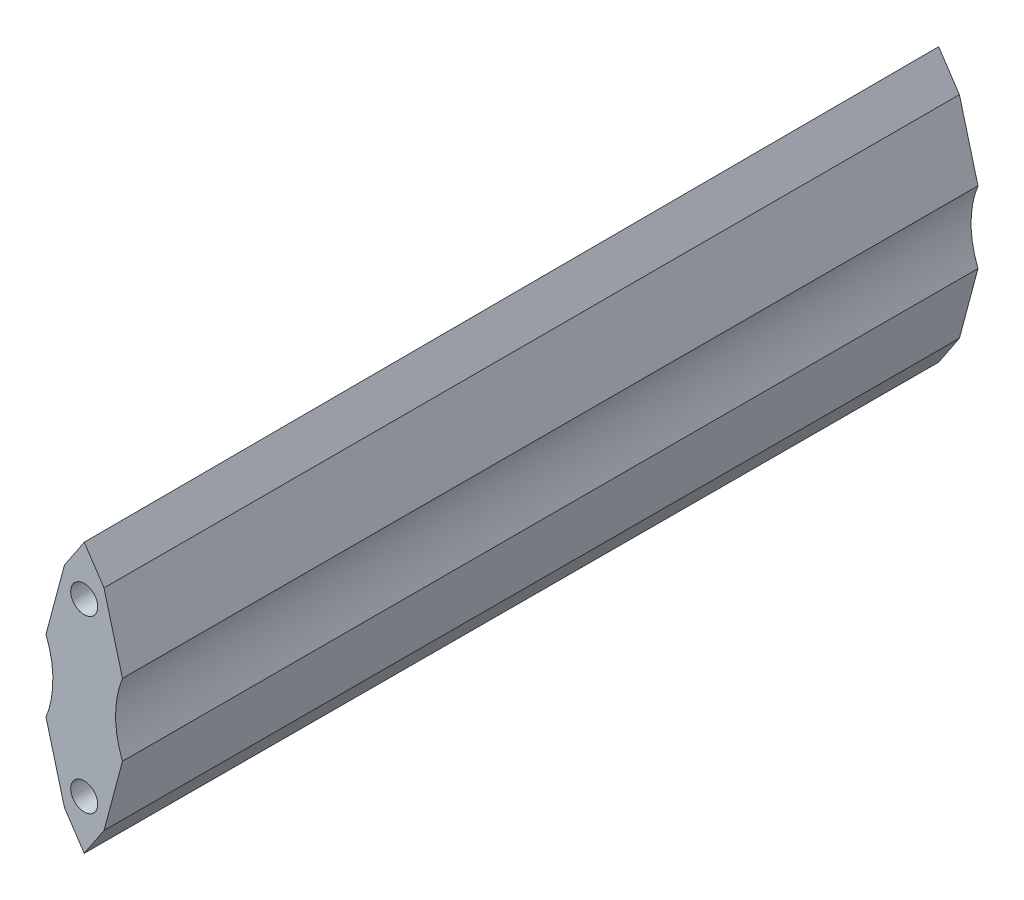
ISO-10303-21;
HEADER;
FILE_DESCRIPTION(('STEP AP214'),'2;1');
FILE_NAME('part.step','',(''),(''),'','','');
FILE_SCHEMA(('AUTOMOTIVE_DESIGN { 1 0 10303 214 1 1 1 1 }'));
ENDSEC;
DATA;
#1=APPLICATION_CONTEXT('core data for automotive mechanical design processes');
#2=APPLICATION_PROTOCOL_DEFINITION('international standard','automotive_design',2000,#1);
#3=PRODUCT_CONTEXT('',#1,'mechanical');
#4=PRODUCT('Part','Part','',(#3));
#5=PRODUCT_RELATED_PRODUCT_CATEGORY('part','',(#4));
#6=PRODUCT_DEFINITION_FORMATION('','',#4);
#7=PRODUCT_DEFINITION_CONTEXT('part definition',#1,'design');
#8=PRODUCT_DEFINITION('design','',#6,#7);
#9=PRODUCT_DEFINITION_SHAPE('','',#8);
#10=(LENGTH_UNIT() NAMED_UNIT(*) SI_UNIT(.MILLI.,.METRE.));
#11=(NAMED_UNIT(*) PLANE_ANGLE_UNIT() SI_UNIT($,.RADIAN.));
#12=(NAMED_UNIT(*) SI_UNIT($,.STERADIAN.) SOLID_ANGLE_UNIT());
#13=UNCERTAINTY_MEASURE_WITH_UNIT(LENGTH_MEASURE(1.E-05),#10,'distance_accuracy_value','');
#14=(GEOMETRIC_REPRESENTATION_CONTEXT(3) GLOBAL_UNCERTAINTY_ASSIGNED_CONTEXT((#13)) GLOBAL_UNIT_ASSIGNED_CONTEXT((#10,
#11,#12)) REPRESENTATION_CONTEXT('',''));
#15=CARTESIAN_POINT('',(0.,0.,0.));
#16=DIRECTION('',(0.,0.,1.));
#17=DIRECTION('',(1.,0.,0.));
#18=AXIS2_PLACEMENT_3D('',#15,#16,#17);
#19=CARTESIAN_POINT('',(0.,0.,709.));
#20=DIRECTION('',(0.,0.,-1.));
#21=DIRECTION('',(-1.,0.,0.));
#22=AXIS2_PLACEMENT_3D('',#19,#20,#21);
#23=PLANE('',#22);
#24=CARTESIAN_POINT('',(0.,0.,709.));
#25=DIRECTION('',(0.,0.,-1.));
#26=DIRECTION('',(-1.,0.,0.));
#27=AXIS2_PLACEMENT_3D('',#24,#25,#26);
#28=CIRCLE('',#27,3.1);
#29=CARTESIAN_POINT('',(-3.1,0.,709.));
#30=VERTEX_POINT('',#29);
#31=EDGE_CURVE('E408',#30,#30,#28,.T.);
#32=ORIENTED_EDGE('',*,*,#31,.T.);
#33=EDGE_LOOP('',(#32));
#34=FACE_BOUND('',#33,.T.);
#35=ADVANCED_FACE('F273',(#34),#23,.T.);
#36=CARTESIAN_POINT('',(0.,0.,709.));
#37=DIRECTION('',(0.,0.,-1.));
#38=DIRECTION('',(-1.,0.,0.));
#39=AXIS2_PLACEMENT_3D('',#36,#37,#38);
#40=CYLINDRICAL_SURFACE('',#39,3.1);
#41=ORIENTED_EDGE('',*,*,#31,.F.);
#42=EDGE_LOOP('',(#41));
#43=FACE_BOUND('',#42,.T.);
#44=CARTESIAN_POINT('',(0.,0.,540.));
#45=DIRECTION('',(0.,0.,-1.));
#46=DIRECTION('',(-1.,0.,0.));
#47=AXIS2_PLACEMENT_3D('',#44,#45,#46);
#48=CIRCLE('',#47,3.1);
#49=CARTESIAN_POINT('',(-3.1,0.,540.));
#50=VERTEX_POINT('',#49);
#51=EDGE_CURVE('E372',#50,#50,#48,.F.);
#52=ORIENTED_EDGE('',*,*,#51,.F.);
#53=EDGE_LOOP('',(#52));
#54=FACE_BOUND('',#53,.T.);
#55=ADVANCED_FACE('F462',(#43,#54),#40,.F.);
#56=CARTESIAN_POINT('',(0.,0.,540.));
#57=DIRECTION('',(0.,0.,-1.));
#58=DIRECTION('',(-1.,0.,0.));
#59=AXIS2_PLACEMENT_3D('',#56,#57,#58);
#60=PLANE('',#59);
#61=DIRECTION('',(-0.554700196225229,0.832050294337843,0.));
#62=VECTOR('',#61,1.);
#63=CARTESIAN_POINT('',(4.43836605132196,22.125577367548,540.));
#64=LINE('',#63,#62);
#65=CARTESIAN_POINT('',(4.3765195891001,22.2183470608808,540.));
#66=VERTEX_POINT('',#65);
#67=CARTESIAN_POINT('',(0.,28.7831264445309,540.));
#68=VERTEX_POINT('',#67);
#69=EDGE_CURVE('E297',#66,#68,#64,.T.);
#70=ORIENTED_EDGE('',*,*,#69,.F.);
#71=DIRECTION('',(-0.257662650560332,0.966234939601246,0.));
#72=VECTOR('',#71,1.);
#73=CARTESIAN_POINT('',(8.34779141576916,7.32607771087177,540.));
#74=LINE('',#73,#72);
#75=CARTESIAN_POINT('',(8.28948820335662,7.5447147574188,540.));
#76=VERTEX_POINT('',#75);
#77=EDGE_CURVE('E365',#76,#66,#74,.T.);
#78=ORIENTED_EDGE('',*,*,#77,.F.);
#79=CARTESIAN_POINT('',(8.28948820335662,-7.5447147574188,540.));
#80=CARTESIAN_POINT('',(8.16788936033876,-7.24327679274731,540.));
#81=CARTESIAN_POINT('',(8.053594474769,-6.93895346568857,540.));
#82=CARTESIAN_POINT('',(7.83983458670277,-6.32513062381595,540.));
#83=CARTESIAN_POINT('',(7.74037009694776,-6.01563093044727,540.));
#84=CARTESIAN_POINT('',(7.46431216810121,-5.07942633163217,540.));
#85=CARTESIAN_POINT('',(7.31039273089406,-4.44585502655953,540.));
#86=CARTESIAN_POINT('',(7.08049748672042,-3.24982862460816,540.));
#87=CARTESIAN_POINT('',(6.99700964322208,-2.68878816076937,540.));
#88=CARTESIAN_POINT('',(6.87754812481308,-1.5614223952776,540.));
#89=CARTESIAN_POINT('',(6.84159104499509,-0.995095317296532,540.));
#90=CARTESIAN_POINT('',(6.81750431666551,0.13875542037362,540.));
#91=CARTESIAN_POINT('',(6.82939197833938,0.706279438879072,540.));
#92=CARTESIAN_POINT('',(6.90095198774333,1.83819521531441,540.));
#93=CARTESIAN_POINT('',(6.9606107941134,2.40258781524157,540.));
#94=CARTESIAN_POINT('',(7.10223869209335,3.35599310594814,540.));
#95=CARTESIAN_POINT('',(7.17215166545461,3.74684201891957,540.));
#96=CARTESIAN_POINT('',(7.33491632560443,4.52372904182977,540.));
#97=CARTESIAN_POINT('',(7.42776640070957,4.90976748777659,540.));
#98=CARTESIAN_POINT('',(7.63590938733737,5.67503186948532,540.));
#99=CARTESIAN_POINT('',(7.75116372749119,6.05426830714647,540.));
#100=CARTESIAN_POINT('',(8.00381988497511,6.8053673766568,540.));
#101=CARTESIAN_POINT('',(8.14122574522677,7.17722864850874,540.));
#102=CARTESIAN_POINT('',(8.28948820335662,7.5447147574188,540.));
#103=B_SPLINE_CURVE_WITH_KNOTS('',3,(#79,#80,#81,#82,#83,#84,#85,#86,#87,#88,#89,#90,#91,#92,
#93,#94,#95,#96,#97,#98,#99,#100,#101,#102),.UNSPECIFIED.,.F.,.F.,(4,2,2,2,2,2,2,2,2,2,2,4),(0.,
0.974912469298583,1.94985863710311,3.90245406134598,5.60220869075517,7.30255662310152,
9.00351979512776,10.7040009773577,11.8945210233999,13.0849574409191,14.2733622596533,
15.4619842227735),.UNSPECIFIED.);
#104=CARTESIAN_POINT('',(8.28948820335662,-7.5447147574188,540.));
#105=VERTEX_POINT('',#104);
#106=EDGE_CURVE('E466',#105,#76,#103,.T.);
#107=ORIENTED_EDGE('',*,*,#106,.F.);
#108=DIRECTION('',(0.257662650560332,0.966234939601246,0.));
#109=VECTOR('',#108,1.);
#110=CARTESIAN_POINT('',(4.34779141576916,-22.3260777108718,540.));
#111=LINE('',#110,#109);
#112=CARTESIAN_POINT('',(4.3765195891001,-22.2183470608808,540.));
#113=VERTEX_POINT('',#112);
#114=EDGE_CURVE('E427',#113,#105,#111,.T.);
#115=ORIENTED_EDGE('',*,*,#114,.F.);
#116=DIRECTION('',(0.554700196225229,0.832050294337843,0.));
#117=VECTOR('',#116,1.);
#118=CARTESIAN_POINT('',(-0.561633948678042,-29.625577367548,540.));
#119=LINE('',#118,#117);
#120=CARTESIAN_POINT('',(0.,-28.7831264445309,540.));
#121=VERTEX_POINT('',#120);
#122=EDGE_CURVE('E425',#121,#113,#119,.T.);
#123=ORIENTED_EDGE('',*,*,#122,.F.);
#124=DIRECTION('',(0.554700196225229,-0.832050294337843,0.));
#125=VECTOR('',#124,1.);
#126=CARTESIAN_POINT('',(-4.43836605132195,-22.125577367548,540.));
#127=LINE('',#126,#125);
#128=CARTESIAN_POINT('',(-4.37651958910009,-22.2183470608808,540.));
#129=VERTEX_POINT('',#128);
#130=EDGE_CURVE('E511',#129,#121,#127,.T.);
#131=ORIENTED_EDGE('',*,*,#130,.F.);
#132=DIRECTION('',(0.257662650560333,-0.966234939601246,0.));
#133=VECTOR('',#132,1.);
#134=CARTESIAN_POINT('',(-8.34779141576916,-7.32607771087178,540.));
#135=LINE('',#134,#133);
#136=CARTESIAN_POINT('',(-8.28948820335662,-7.54471475741881,540.));
#137=VERTEX_POINT('',#136);
#138=EDGE_CURVE('E480',#137,#129,#135,.T.);
#139=ORIENTED_EDGE('',*,*,#138,.F.);
#140=CARTESIAN_POINT('',(-8.28948820335662,7.54471475741881,540.));
#141=CARTESIAN_POINT('',(-8.16788936033876,7.24327679274732,540.));
#142=CARTESIAN_POINT('',(-8.053594474769,6.93895346568857,540.));
#143=CARTESIAN_POINT('',(-7.83983458670277,6.32513062381596,540.));
#144=CARTESIAN_POINT('',(-7.74037009694775,6.01563093044728,540.));
#145=CARTESIAN_POINT('',(-7.46431216810121,5.07942633163218,540.));
#146=CARTESIAN_POINT('',(-7.31039273089407,4.44585502655955,540.));
#147=CARTESIAN_POINT('',(-7.08049748672043,3.24982862460817,540.));
#148=CARTESIAN_POINT('',(-6.99700964322208,2.68878816076938,540.));
#149=CARTESIAN_POINT('',(-6.87754812481308,1.56142239527761,540.));
#150=CARTESIAN_POINT('',(-6.84159104499509,0.995095317296534,540.));
#151=CARTESIAN_POINT('',(-6.81750431666551,-0.138755420373625,540.));
#152=CARTESIAN_POINT('',(-6.82939197833938,-0.706279438879081,540.));
#153=CARTESIAN_POINT('',(-6.90095198774333,-1.83819521531443,540.));
#154=CARTESIAN_POINT('',(-6.9606107941134,-2.40258781524159,540.));
#155=CARTESIAN_POINT('',(-7.10223869209336,-3.35599310594816,540.));
#156=CARTESIAN_POINT('',(-7.17215166545461,-3.74684201891959,540.));
#157=CARTESIAN_POINT('',(-7.33491632560443,-4.52372904182979,540.));
#158=CARTESIAN_POINT('',(-7.42776640070957,-4.9097674877766,540.));
#159=CARTESIAN_POINT('',(-7.63590938733738,-5.67503186948533,540.));
#160=CARTESIAN_POINT('',(-7.75116372749119,-6.05426830714648,540.));
#161=CARTESIAN_POINT('',(-8.00381988497512,-6.80536737665681,540.));
#162=CARTESIAN_POINT('',(-8.14122574522677,-7.17722864850875,540.));
#163=CARTESIAN_POINT('',(-8.28948820335662,-7.54471475741881,540.));
#164=B_SPLINE_CURVE_WITH_KNOTS('',3,(#140,#141,#142,#143,#144,#145,#146,#147,#148,#149,#150,
#151,#152,#153,#154,#155,#156,#157,#158,#159,#160,#161,#162,#163),.UNSPECIFIED.,.F.,.F.,(4,2,2,
2,2,2,2,2,2,2,2,4),(0.,0.974912469298578,1.9498586371031,3.90245406134596,5.60220869075516,
7.30255662310153,9.00351979512778,10.7040009773578,11.8945210233999,13.0849574409191,
14.2733622596533,15.4619842227735),.UNSPECIFIED.);
#165=CARTESIAN_POINT('',(-8.28948820335662,7.54471475741881,540.));
#166=VERTEX_POINT('',#165);
#167=EDGE_CURVE('E473',#166,#137,#164,.T.);
#168=ORIENTED_EDGE('',*,*,#167,.F.);
#169=DIRECTION('',(-0.257662650560333,-0.966234939601246,0.));
#170=VECTOR('',#169,1.);
#171=CARTESIAN_POINT('',(-4.34779141576916,22.3260777108718,540.));
#172=LINE('',#171,#170);
#173=CARTESIAN_POINT('',(-4.37651958910009,22.2183470608808,540.));
#174=VERTEX_POINT('',#173);
#175=EDGE_CURVE('E483',#174,#166,#172,.T.);
#176=ORIENTED_EDGE('',*,*,#175,.F.);
#177=DIRECTION('',(-0.554700196225229,-0.832050294337843,0.));
#178=VECTOR('',#177,1.);
#179=CARTESIAN_POINT('',(0.561633948678049,29.625577367548,540.));
#180=LINE('',#179,#178);
#181=EDGE_CURVE('E485',#68,#174,#180,.T.);
#182=ORIENTED_EDGE('',*,*,#181,.F.);
#183=EDGE_LOOP('',(#70,#78,#107,#115,#123,#131,#139,#168,#176,#182));
#184=FACE_BOUND('',#183,.T.);
#185=ORIENTED_EDGE('',*,*,#51,.T.);
#186=EDGE_LOOP('',(#185));
#187=FACE_BOUND('',#186,.T.);
#188=CARTESIAN_POINT('',(0.,-18.,540.));
#189=DIRECTION('',(0.,0.,-1.));
#190=DIRECTION('',(-1.,0.,0.));
#191=AXIS2_PLACEMENT_3D('',#188,#189,#190);
#192=CIRCLE('',#191,2.85);
#193=CARTESIAN_POINT('',(-2.85,-18.,540.));
#194=VERTEX_POINT('',#193);
#195=EDGE_CURVE('E517',#194,#194,#192,.F.);
#196=ORIENTED_EDGE('',*,*,#195,.T.);
#197=EDGE_LOOP('',(#196));
#198=FACE_BOUND('',#197,.T.);
#199=CARTESIAN_POINT('',(0.,18.,540.));
#200=DIRECTION('',(0.,0.,-1.));
#201=DIRECTION('',(-1.,0.,0.));
#202=AXIS2_PLACEMENT_3D('',#199,#200,#201);
#203=CIRCLE('',#202,2.85);
#204=CARTESIAN_POINT('',(-2.85,18.,540.));
#205=VERTEX_POINT('',#204);
#206=EDGE_CURVE('E515',#205,#205,#203,.F.);
#207=ORIENTED_EDGE('',*,*,#206,.T.);
#208=EDGE_LOOP('',(#207));
#209=FACE_BOUND('',#208,.T.);
#210=ADVANCED_FACE('F456',(#184,#187,#198,#209),#60,.T.);
#211=CARTESIAN_POINT('',(0.,-18.,795.));
#212=DIRECTION('',(0.,0.,-1.));
#213=DIRECTION('',(-1.,0.,0.));
#214=AXIS2_PLACEMENT_3D('',#211,#212,#213);
#215=CYLINDRICAL_SURFACE('',#214,2.85);
#216=CARTESIAN_POINT('',(0.,-18.,720.));
#217=DIRECTION('',(0.,0.,-1.));
#218=DIRECTION('',(-1.,0.,0.));
#219=AXIS2_PLACEMENT_3D('',#216,#217,#218);
#220=CIRCLE('',#219,2.85);
#221=CARTESIAN_POINT('',(-2.85,-18.,720.));
#222=VERTEX_POINT('',#221);
#223=EDGE_CURVE('E522',#222,#222,#220,.F.);
#224=ORIENTED_EDGE('',*,*,#223,.T.);
#225=EDGE_LOOP('',(#224));
#226=FACE_BOUND('',#225,.T.);
#227=ORIENTED_EDGE('',*,*,#195,.F.);
#228=EDGE_LOOP('',(#227));
#229=FACE_BOUND('',#228,.T.);
#230=ADVANCED_FACE('F461',(#226,#229),#215,.F.);
#231=CARTESIAN_POINT('',(0.,18.,795.));
#232=DIRECTION('',(0.,0.,-1.));
#233=DIRECTION('',(-1.,0.,0.));
#234=AXIS2_PLACEMENT_3D('',#231,#232,#233);
#235=CYLINDRICAL_SURFACE('',#234,2.85);
#236=CARTESIAN_POINT('',(0.,18.,720.));
#237=DIRECTION('',(0.,0.,-1.));
#238=DIRECTION('',(-1.,0.,0.));
#239=AXIS2_PLACEMENT_3D('',#236,#237,#238);
#240=CIRCLE('',#239,2.85);
#241=CARTESIAN_POINT('',(-2.85,18.,720.));
#242=VERTEX_POINT('',#241);
#243=EDGE_CURVE('E525',#242,#242,#240,.F.);
#244=ORIENTED_EDGE('',*,*,#243,.T.);
#245=EDGE_LOOP('',(#244));
#246=FACE_BOUND('',#245,.T.);
#247=ORIENTED_EDGE('',*,*,#206,.F.);
#248=EDGE_LOOP('',(#247));
#249=FACE_BOUND('',#248,.T.);
#250=ADVANCED_FACE('F530',(#246,#249),#235,.F.);
#251=CARTESIAN_POINT('',(0.,30.,0.));
#252=DIRECTION('',(-0.832049644299313,0.554699762866209,0.00124999902343864));
#253=DIRECTION('',(-0.554700196225229,-0.832050294337843,0.));
#254=AXIS2_PLACEMENT_3D('',#251,#252,#253);
#255=PLANE('',#254);
#256=DIRECTION('',(-0.554700196225229,-0.832050294337843,0.));
#257=VECTOR('',#256,1.);
#258=CARTESIAN_POINT('',(0.748845264904063,29.5007698233973,720.));
#259=LINE('',#258,#257);
#260=CARTESIAN_POINT('',(0.,28.3775019260412,720.));
#261=VERTEX_POINT('',#260);
#262=CARTESIAN_POINT('',(-4.16869278546679,22.124462747841,720.));
#263=VERTEX_POINT('',#262);
#264=EDGE_CURVE('E493',#261,#263,#259,.T.);
#265=ORIENTED_EDGE('',*,*,#264,.F.);
#266=DIRECTION('',(0.,0.00225346382548676,-0.99999746094717));
#267=VECTOR('',#266,1.);
#268=CARTESIAN_POINT('',(0.,29.098612181134,400.));
#269=LINE('',#268,#267);
#270=EDGE_CURVE('E277',#261,#68,#269,.T.);
#271=ORIENTED_EDGE('',*,*,#270,.T.);
#272=ORIENTED_EDGE('',*,*,#181,.T.);
#273=DIRECTION('',(0.00115459242688266,-0.000521579098286261,0.999999197435464));
#274=VECTOR('',#273,1.);
#275=CARTESIAN_POINT('',(-4.53816265859266,22.291368193245,400.));
#276=LINE('',#275,#274);
#277=EDGE_CURVE('E386',#174,#263,#276,.T.);
#278=ORIENTED_EDGE('',*,*,#277,.T.);
#279=EDGE_LOOP('',(#265,#271,#272,#278));
#280=FACE_BOUND('',#279,.T.);
#281=ADVANCED_FACE('F492',(#280),#255,.T.);
#282=CARTESIAN_POINT('',(-5.,22.5,0.));
#283=DIRECTION('',(-0.966234184731084,0.257662449261623,0.00124999902343865));
#284=DIRECTION('',(-0.257662650560333,-0.966234939601246,0.));
#285=AXIS2_PLACEMENT_3D('',#282,#283,#284);
#286=PLANE('',#285);
#287=DIRECTION('',(-0.257662650560333,-0.966234939601246,0.));
#288=VECTOR('',#287,1.);
#289=CARTESIAN_POINT('',(-4.13038855435887,22.2681036144957,720.));
#290=LINE('',#289,#288);
#291=CARTESIAN_POINT('',(-8.05265093780882,7.55961967655841,720.));
#292=VERTEX_POINT('',#291);
#293=EDGE_CURVE('E362',#263,#292,#290,.T.);
#294=ORIENTED_EDGE('',*,*,#293,.F.);
#295=ORIENTED_EDGE('',*,*,#277,.F.);
#296=ORIENTED_EDGE('',*,*,#175,.T.);
#297=DIRECTION('',(0.00131576144292263,8.2805034369932E-05,0.999999130957198));
#298=VECTOR('',#297,1.);
#299=CARTESIAN_POINT('',(-8.47369496544935,7.53312204253245,400.));
#300=LINE('',#299,#298);
#301=EDGE_CURVE('E389',#166,#292,#300,.T.);
#302=ORIENTED_EDGE('',*,*,#301,.T.);
#303=EDGE_LOOP('',(#294,#295,#296,#302));
#304=FACE_BOUND('',#303,.T.);
#305=ADVANCED_FACE('F498',(#304),#286,.T.);
#306=CARTESIAN_POINT('',(5.,22.5,0.));
#307=DIRECTION('',(0.832049644299313,0.554699762866209,0.00124999902343864));
#308=DIRECTION('',(-0.554700196225229,0.832050294337843,0.));
#309=AXIS2_PLACEMENT_3D('',#306,#307,#308);
#310=PLANE('',#309);
#311=DIRECTION('',(-0.554700196225229,0.832050294337843,0.));
#312=VECTOR('',#311,1.);
#313=CARTESIAN_POINT('',(4.25115473509594,22.0007698233973,720.));
#314=LINE('',#313,#312);
#315=CARTESIAN_POINT('',(4.1686927854668,22.124462747841,720.));
#316=VERTEX_POINT('',#315);
#317=EDGE_CURVE('E352',#316,#261,#314,.T.);
#318=ORIENTED_EDGE('',*,*,#317,.F.);
#319=DIRECTION('',(-0.00115459242688266,-0.000521579098286261,0.999999197435464));
#320=VECTOR('',#319,1.);
#321=CARTESIAN_POINT('',(4.53816265859267,22.291368193245,400.));
#322=LINE('',#321,#320);
#323=EDGE_CURVE('E283',#66,#316,#322,.T.);
#324=ORIENTED_EDGE('',*,*,#323,.F.);
#325=ORIENTED_EDGE('',*,*,#69,.T.);
#326=ORIENTED_EDGE('',*,*,#270,.F.);
#327=EDGE_LOOP('',(#318,#324,#325,#326));
#328=FACE_BOUND('',#327,.T.);
#329=ADVANCED_FACE('F361',(#328),#310,.T.);
#330=CARTESIAN_POINT('',(-9.,7.5,0.));
#331=CARTESIAN_POINT('',(-7.94738993089869,7.5662440850649,800.));
#332=CARTESIAN_POINT('',(-8.75325555323637,6.9078133277673,0.));
#333=CARTESIAN_POINT('',(-7.70903785971492,6.96604813310095,800.));
#334=CARTESIAN_POINT('',(-8.31825720304425,5.69906975911781,0.));
#335=CARTESIAN_POINT('',(-7.28909415940078,5.74311601064957,800.000000000001));
#336=CARTESIAN_POINT('',(-7.84760675080053,3.8304786498399,0.));
#337=CARTESIAN_POINT('',(-6.83510364276034,3.85745789019627,799.999999999999));
#338=CARTESIAN_POINT('',(-7.5633644339186,1.92460591348961,0.));
#339=CARTESIAN_POINT('',(-6.56107216414013,1.93737438025298,800.));
#340=CARTESIAN_POINT('',(-7.5,0.641535561585432,0.));
#341=CARTESIAN_POINT('',(-6.5,0.645791677394109,800.));
#342=CARTESIAN_POINT('',(-7.5,-0.641535561585428,0.));
#343=CARTESIAN_POINT('',(-6.5,-0.64579167739411,800.));
#344=CARTESIAN_POINT('',(-7.56336443391862,-1.92460591348961,0.));
#345=CARTESIAN_POINT('',(-6.56107216414012,-1.93737438025299,799.999999999999));
#346=CARTESIAN_POINT('',(-7.84760675080051,-3.83047864983989,0.));
#347=CARTESIAN_POINT('',(-6.83510364276035,-3.85745789019627,800.000000000001));
#348=CARTESIAN_POINT('',(-8.31825720304427,-5.69906975911781,0.));
#349=CARTESIAN_POINT('',(-7.28909415940077,-5.74311601064957,800.));
#350=CARTESIAN_POINT('',(-8.75325555323637,-6.90781332776729,0.));
#351=CARTESIAN_POINT('',(-7.70903785971492,-6.96604813310096,800.));
#352=CARTESIAN_POINT('',(-9.,-7.5,0.));
#353=CARTESIAN_POINT('',(-7.94738993089869,-7.5662440850649,800.));
#354=B_SPLINE_SURFACE_WITH_KNOTS('',3,1,((#330,#331),(#332,#333),(#334,#335),(#336,#337),(#338,
#339),(#340,#341),(#342,#343),(#344,#345),(#346,#347),(#348,#349),(#350,#351),(#352,#353)),
.UNSPECIFIED.,.F.,.F.,.F.,(4,1,1,1,2,1,1,1,4),(2,2),(0.,0.125,0.25,0.375,0.5,0.625,0.75,0.875,
1.),(0.,1.),.UNSPECIFIED.);
#355=CARTESIAN_POINT('',(-8.05265093780882,7.55961967655841,720.));
#356=CARTESIAN_POINT('',(-7.93220568628093,7.25777733363349,720.));
#357=CARTESIAN_POINT('',(-7.81899002130977,6.95310929630239,720.));
#358=CARTESIAN_POINT('',(-7.60723320406377,6.33870504577705,720.));
#359=CARTESIAN_POINT('',(-7.50869250710435,6.0289686756601,720.));
#360=CARTESIAN_POINT('',(-7.23515391465796,5.0921612173794,720.));
#361=CARTESIAN_POINT('',(-7.08258797794095,4.45836512307391,720.));
#362=CARTESIAN_POINT('',(-6.85334817282111,3.25570753730072,720.));
#363=CARTESIAN_POINT('',(-6.76978546233478,2.6881336602734,720.));
#364=CARTESIAN_POINT('',(-6.65072532514923,1.54771331074024,720.));
#365=CARTESIAN_POINT('',(-6.61524502688033,0.974865032454896,720.));
#366=CARTESIAN_POINT('',(-6.59266060956356,-0.171953808416335,720.));
#367=CARTESIAN_POINT('',(-6.60557290139224,-0.745924685734591,720.));
#368=CARTESIAN_POINT('',(-6.67972163339617,-1.89061917109885,720.));
#369=CARTESIAN_POINT('',(-6.7409438119009,-2.46134368743574,720.));
#370=CARTESIAN_POINT('',(-6.88433959413653,-3.41647443128717,720.));
#371=CARTESIAN_POINT('',(-6.95380380244713,-3.80283899241907,720.));
#372=CARTESIAN_POINT('',(-7.11490067329191,-4.57091314431726,720.));
#373=CARTESIAN_POINT('',(-7.20653171780184,-4.9526230727041,720.));
#374=CARTESIAN_POINT('',(-7.4114805698083,-5.70943893134181,720.));
#375=CARTESIAN_POINT('',(-7.52475942830775,-6.08455542069633,720.));
#376=CARTESIAN_POINT('',(-7.77273795736463,-6.82771802305068,720.));
#377=CARTESIAN_POINT('',(-7.90744164253734,-7.1957627964267,720.));
#378=CARTESIAN_POINT('',(-8.05265093780882,-7.55961967655841,720.));
#379=B_SPLINE_CURVE_WITH_KNOTS('',3,(#355,#356,#357,#358,#359,#360,#361,#362,#363,#364,#365,
#366,#367,#368,#369,#370,#371,#372,#373,#374,#375,#376,#377,#378),.UNSPECIFIED.,.F.,.F.,(4,2,2,
2,2,2,2,2,2,2,2,4),(0.,0.974755186623848,1.9495406103593,3.90192081303197,5.62106982350202,
7.34083108675059,9.06117560754088,10.781012451464,11.9580921364717,13.135085928792,
14.3099816654009,15.4850978156175),.UNSPECIFIED.);
#380=CARTESIAN_POINT('',(-8.05265093780882,-7.55961967655841,720.));
#381=VERTEX_POINT('',#380);
#382=EDGE_CURVE('E363',#292,#381,#379,.T.);
#383=DIRECTION('',(0.00131576144292262,-8.28050343699494E-05,0.999999130957198));
#384=VECTOR('',#383,1.);
#385=CARTESIAN_POINT('',(-8.47369496544935,-7.53312204253245,400.));
#386=LINE('',#385,#384);
#387=EDGE_CURVE('E392',#137,#381,#386,.T.);
#388=ORIENTED_EDGE('',*,*,#382,.F.);
#389=ORIENTED_EDGE('',*,*,#301,.F.);
#390=ORIENTED_EDGE('',*,*,#167,.T.);
#391=ORIENTED_EDGE('',*,*,#387,.T.);
#392=EDGE_LOOP('',(#388,#389,#390,#391));
#393=FACE_BOUND('',#392,.T.);
#394=ADVANCED_FACE('F446',(#393),#354,.T.);
#395=CARTESIAN_POINT('',(-9.,-7.5,0.));
#396=DIRECTION('',(-0.966234184731084,-0.257662449261623,0.00124999902343865));
#397=DIRECTION('',(0.257662650560333,-0.966234939601246,0.));
#398=AXIS2_PLACEMENT_3D('',#395,#396,#397);
#399=PLANE('',#398);
#400=DIRECTION('',(0.257662650560333,-0.966234939601246,0.));
#401=VECTOR('',#400,1.);
#402=CARTESIAN_POINT('',(-8.13038855435888,-7.2681036144957,720.));
#403=LINE('',#402,#401);
#404=CARTESIAN_POINT('',(-4.16869278546679,-22.124462747841,720.));
#405=VERTEX_POINT('',#404);
#406=EDGE_CURVE('E439',#381,#405,#403,.T.);
#407=ORIENTED_EDGE('',*,*,#406,.F.);
#408=ORIENTED_EDGE('',*,*,#387,.F.);
#409=ORIENTED_EDGE('',*,*,#138,.T.);
#410=DIRECTION('',(0.00115459242688266,0.000521579098286261,0.999999197435464));
#411=VECTOR('',#410,1.);
#412=CARTESIAN_POINT('',(-4.53816265859266,-22.291368193245,400.));
#413=LINE('',#412,#411);
#414=EDGE_CURVE('E395',#129,#405,#413,.T.);
#415=ORIENTED_EDGE('',*,*,#414,.T.);
#416=EDGE_LOOP('',(#407,#408,#409,#415));
#417=FACE_BOUND('',#416,.T.);
#418=ADVANCED_FACE('F505',(#417),#399,.T.);
#419=CARTESIAN_POINT('',(-5.,-22.5,0.));
#420=DIRECTION('',(-0.832049644299313,-0.554699762866209,0.00124999902343864));
#421=DIRECTION('',(0.554700196225229,-0.832050294337843,0.));
#422=AXIS2_PLACEMENT_3D('',#419,#420,#421);
#423=PLANE('',#422);
#424=DIRECTION('',(0.554700196225229,-0.832050294337843,0.));
#425=VECTOR('',#424,1.);
#426=CARTESIAN_POINT('',(-4.25115473509594,-22.0007698233973,720.));
#427=LINE('',#426,#425);
#428=CARTESIAN_POINT('',(0.,-28.3775019260412,720.));
#429=VERTEX_POINT('',#428);
#430=EDGE_CURVE('E430',#405,#429,#427,.T.);
#431=ORIENTED_EDGE('',*,*,#430,.F.);
#432=ORIENTED_EDGE('',*,*,#414,.F.);
#433=ORIENTED_EDGE('',*,*,#130,.T.);
#434=DIRECTION('',(0.,0.00225346382548676,0.99999746094717));
#435=VECTOR('',#434,1.);
#436=CARTESIAN_POINT('',(0.,-29.098612181134,400.));
#437=LINE('',#436,#435);
#438=EDGE_CURVE('E400',#121,#429,#437,.T.);
#439=ORIENTED_EDGE('',*,*,#438,.T.);
#440=EDGE_LOOP('',(#431,#432,#433,#439));
#441=FACE_BOUND('',#440,.T.);
#442=ADVANCED_FACE('F510',(#441),#423,.T.);
#443=CARTESIAN_POINT('',(0.,-30.,0.));
#444=DIRECTION('',(0.832049644299313,-0.554699762866209,0.00124999902343864));
#445=DIRECTION('',(0.554700196225229,0.832050294337843,0.));
#446=AXIS2_PLACEMENT_3D('',#443,#444,#445);
#447=PLANE('',#446);
#448=DIRECTION('',(0.554700196225229,0.832050294337843,0.));
#449=VECTOR('',#448,1.);
#450=CARTESIAN_POINT('',(-0.748845264904056,-29.5007698233973,720.));
#451=LINE('',#450,#449);
#452=CARTESIAN_POINT('',(4.1686927854668,-22.124462747841,720.));
#453=VERTEX_POINT('',#452);
#454=EDGE_CURVE('E424',#429,#453,#451,.T.);
#455=ORIENTED_EDGE('',*,*,#454,.F.);
#456=ORIENTED_EDGE('',*,*,#438,.F.);
#457=ORIENTED_EDGE('',*,*,#122,.T.);
#458=DIRECTION('',(-0.00115459242688266,0.000521579098286261,0.999999197435464));
#459=VECTOR('',#458,1.);
#460=CARTESIAN_POINT('',(4.53816265859267,-22.291368193245,400.));
#461=LINE('',#460,#459);
#462=EDGE_CURVE('E404',#113,#453,#461,.T.);
#463=ORIENTED_EDGE('',*,*,#462,.T.);
#464=EDGE_LOOP('',(#455,#456,#457,#463));
#465=FACE_BOUND('',#464,.T.);
#466=ADVANCED_FACE('F422',(#465),#447,.T.);
#467=CARTESIAN_POINT('',(5.,-22.5,0.));
#468=DIRECTION('',(0.966234184731084,-0.257662449261622,0.00124999902343865));
#469=DIRECTION('',(0.257662650560332,0.966234939601246,0.));
#470=AXIS2_PLACEMENT_3D('',#467,#468,#469);
#471=PLANE('',#470);
#472=DIRECTION('',(0.257662650560332,0.966234939601246,0.));
#473=VECTOR('',#472,1.);
#474=CARTESIAN_POINT('',(4.13038855435888,-22.2681036144957,720.));
#475=LINE('',#474,#473);
#476=CARTESIAN_POINT('',(8.05265093780882,-7.55961967655841,720.));
#477=VERTEX_POINT('',#476);
#478=EDGE_CURVE('E428',#453,#477,#475,.T.);
#479=ORIENTED_EDGE('',*,*,#478,.F.);
#480=ORIENTED_EDGE('',*,*,#462,.F.);
#481=ORIENTED_EDGE('',*,*,#114,.T.);
#482=DIRECTION('',(-0.00131576144292263,-8.28050343699494E-05,0.999999130957198));
#483=VECTOR('',#482,1.);
#484=CARTESIAN_POINT('',(8.47369496544935,-7.53312204253245,400.));
#485=LINE('',#484,#483);
#486=EDGE_CURVE('E368',#105,#477,#485,.T.);
#487=ORIENTED_EDGE('',*,*,#486,.T.);
#488=EDGE_LOOP('',(#479,#480,#481,#487));
#489=FACE_BOUND('',#488,.T.);
#490=ADVANCED_FACE('F426',(#489),#471,.T.);
#491=CARTESIAN_POINT('',(9.,-7.5,0.));
#492=CARTESIAN_POINT('',(7.94738993089869,-7.5662440850649,800.));
#493=CARTESIAN_POINT('',(8.75325555323637,-6.90781332776729,0.));
#494=CARTESIAN_POINT('',(7.70903785971492,-6.96604813310095,800.));
#495=CARTESIAN_POINT('',(8.31825720304428,-5.69906975911781,0.));
#496=CARTESIAN_POINT('',(7.28909415940079,-5.74311601064957,800.000000000001));
#497=CARTESIAN_POINT('',(7.8476067508005,-3.83047864983989,0.));
#498=CARTESIAN_POINT('',(6.83510364276033,-3.85745789019627,799.999999999999));
#499=CARTESIAN_POINT('',(7.56336443391863,-1.92460591348961,0.));
#500=CARTESIAN_POINT('',(6.56107216414014,-1.93737438025299,800.000000000001));
#501=CARTESIAN_POINT('',(7.5,-0.64153556158543,0.));
#502=CARTESIAN_POINT('',(6.5,-0.645791677394112,800.));
#503=CARTESIAN_POINT('',(7.5,0.64153556158543,0.));
#504=CARTESIAN_POINT('',(6.5,0.645791677394106,800.));
#505=CARTESIAN_POINT('',(7.56336443391863,1.92460591348961,0.));
#506=CARTESIAN_POINT('',(6.56107216414012,1.93737438025298,800.));
#507=CARTESIAN_POINT('',(7.8476067508005,3.83047864983989,0.));
#508=CARTESIAN_POINT('',(6.83510364276035,3.85745789019627,800.));
#509=CARTESIAN_POINT('',(8.31825720304427,5.69906975911781,0.));
#510=CARTESIAN_POINT('',(7.28909415940077,5.74311601064956,800.));
#511=CARTESIAN_POINT('',(8.75325555323637,6.9078133277673,0.));
#512=CARTESIAN_POINT('',(7.70903785971492,6.96604813310095,800.));
#513=CARTESIAN_POINT('',(9.,7.5,0.));
#514=CARTESIAN_POINT('',(7.94738993089869,7.56624408506489,800.));
#515=B_SPLINE_SURFACE_WITH_KNOTS('',3,1,((#491,#492),(#493,#494),(#495,#496),(#497,#498),(#499,
#500),(#501,#502),(#503,#504),(#505,#506),(#507,#508),(#509,#510),(#511,#512),(#513,#514)),
.UNSPECIFIED.,.F.,.F.,.F.,(4,1,1,1,2,1,1,1,4),(2,2),(0.,0.125,0.25,0.375,0.5,0.625,0.75,0.875,
1.),(0.,1.),.UNSPECIFIED.);
#516=CARTESIAN_POINT('',(8.05265093780882,-7.55961967655841,720.));
#517=CARTESIAN_POINT('',(7.93220568628093,-7.25777733363349,720.));
#518=CARTESIAN_POINT('',(7.81899002130977,-6.95310929630238,720.));
#519=CARTESIAN_POINT('',(7.60723320406377,-6.33870504577704,720.));
#520=CARTESIAN_POINT('',(7.50869250710435,-6.02896867566009,720.));
#521=CARTESIAN_POINT('',(7.23515391465796,-5.09216121737938,720.));
#522=CARTESIAN_POINT('',(7.08258797794094,-4.45836512307389,720.));
#523=CARTESIAN_POINT('',(6.85334817282111,-3.25570753730072,720.));
#524=CARTESIAN_POINT('',(6.76978546233478,-2.68813366027342,720.));
#525=CARTESIAN_POINT('',(6.65072532514923,-1.5477133107403,720.));
#526=CARTESIAN_POINT('',(6.61524502688034,-0.974865032454978,720.));
#527=CARTESIAN_POINT('',(6.59266060956356,0.171953808416211,720.));
#528=CARTESIAN_POINT('',(6.60557290139224,0.745924685734447,720.));
#529=CARTESIAN_POINT('',(6.67972163339615,1.89061917109867,720.));
#530=CARTESIAN_POINT('',(6.74094381190088,2.46134368743553,720.));
#531=CARTESIAN_POINT('',(6.8843395941365,3.41647443128696,720.));
#532=CARTESIAN_POINT('',(6.95380380244709,3.80283899241888,720.));
#533=CARTESIAN_POINT('',(7.11490067329188,4.57091314431711,720.));
#534=CARTESIAN_POINT('',(7.2065317178018,4.95262307270397,720.));
#535=CARTESIAN_POINT('',(7.41148056980827,5.70943893134171,720.));
#536=CARTESIAN_POINT('',(7.52475942830772,6.08455542069625,720.));
#537=CARTESIAN_POINT('',(7.77273795736462,6.82771802305064,720.));
#538=CARTESIAN_POINT('',(7.90744164253733,7.19576279642667,720.));
#539=CARTESIAN_POINT('',(8.05265093780882,7.5596196765584,720.));
#540=B_SPLINE_CURVE_WITH_KNOTS('',3,(#516,#517,#518,#519,#520,#521,#522,#523,#524,#525,#526,
#527,#528,#529,#530,#531,#532,#533,#534,#535,#536,#537,#538,#539),.UNSPECIFIED.,.F.,.F.,(4,2,2,
2,2,2,2,2,2,2,2,4),(0.,0.974755186623853,1.94954061035931,3.90192081303199,5.62106982350198,
7.34083108675049,9.06117560754071,10.7810124514638,11.9580921364715,13.1350859287919,
14.3099816654008,15.4850978156175),.UNSPECIFIED.);
#541=CARTESIAN_POINT('',(8.05265093780882,7.5596196765584,720.));
#542=VERTEX_POINT('',#541);
#543=EDGE_CURVE('E289',#477,#542,#540,.T.);
#544=DIRECTION('',(-0.00131576144292263,8.2805034369932E-05,0.999999130957198));
#545=VECTOR('',#544,1.);
#546=CARTESIAN_POINT('',(8.47369496544934,7.53312204253244,400.));
#547=LINE('',#546,#545);
#548=EDGE_CURVE('E366',#76,#542,#547,.T.);
#549=ORIENTED_EDGE('',*,*,#543,.F.);
#550=ORIENTED_EDGE('',*,*,#486,.F.);
#551=ORIENTED_EDGE('',*,*,#106,.T.);
#552=ORIENTED_EDGE('',*,*,#548,.T.);
#553=EDGE_LOOP('',(#549,#550,#551,#552));
#554=FACE_BOUND('',#553,.T.);
#555=ADVANCED_FACE('F565',(#554),#515,.T.);
#556=CARTESIAN_POINT('',(9.,7.5,0.));
#557=DIRECTION('',(0.966234184731084,0.257662449261622,0.00124999902343865));
#558=DIRECTION('',(-0.257662650560332,0.966234939601246,0.));
#559=AXIS2_PLACEMENT_3D('',#556,#557,#558);
#560=PLANE('',#559);
#561=DIRECTION('',(-0.257662650560332,0.966234939601246,0.));
#562=VECTOR('',#561,1.);
#563=CARTESIAN_POINT('',(8.13038855435888,7.2681036144957,720.));
#564=LINE('',#563,#562);
#565=EDGE_CURVE('E13',#542,#316,#564,.T.);
#566=ORIENTED_EDGE('',*,*,#565,.F.);
#567=ORIENTED_EDGE('',*,*,#548,.F.);
#568=ORIENTED_EDGE('',*,*,#77,.T.);
#569=ORIENTED_EDGE('',*,*,#323,.T.);
#570=EDGE_LOOP('',(#566,#567,#568,#569));
#571=FACE_BOUND('',#570,.T.);
#572=ADVANCED_FACE('F275',(#571),#560,.T.);
#573=CARTESIAN_POINT('',(0.,0.,720.));
#574=DIRECTION('',(0.,0.,-1.));
#575=DIRECTION('',(-1.,0.,0.));
#576=AXIS2_PLACEMENT_3D('',#573,#574,#575);
#577=PLANE('',#576);
#578=ORIENTED_EDGE('',*,*,#243,.F.);
#579=EDGE_LOOP('',(#578));
#580=FACE_BOUND('',#579,.T.);
#581=ORIENTED_EDGE('',*,*,#264,.T.);
#582=ORIENTED_EDGE('',*,*,#293,.T.);
#583=ORIENTED_EDGE('',*,*,#382,.T.);
#584=ORIENTED_EDGE('',*,*,#406,.T.);
#585=ORIENTED_EDGE('',*,*,#430,.T.);
#586=ORIENTED_EDGE('',*,*,#454,.T.);
#587=ORIENTED_EDGE('',*,*,#478,.T.);
#588=ORIENTED_EDGE('',*,*,#543,.T.);
#589=ORIENTED_EDGE('',*,*,#565,.T.);
#590=ORIENTED_EDGE('',*,*,#317,.T.);
#591=EDGE_LOOP('',(#581,#582,#583,#584,#585,#586,#587,#588,#589,#590));
#592=FACE_BOUND('',#591,.T.);
#593=ORIENTED_EDGE('',*,*,#223,.F.);
#594=EDGE_LOOP('',(#593));
#595=FACE_BOUND('',#594,.T.);
#596=ADVANCED_FACE('F350',(#580,#592,#595),#577,.F.);
#597=CLOSED_SHELL('',(#35,#55,#210,#230,#250,#281,#305,#329,#394,#418,#442,#466,#490,#555,#572,#596));
#598=MANIFOLD_SOLID_BREP('B2',#597);
#599=ADVANCED_BREP_SHAPE_REPRESENTATION('',(#18,#598),#14);
#600=SHAPE_DEFINITION_REPRESENTATION(#9,#599);
ENDSEC;
END-ISO-10303-21;
